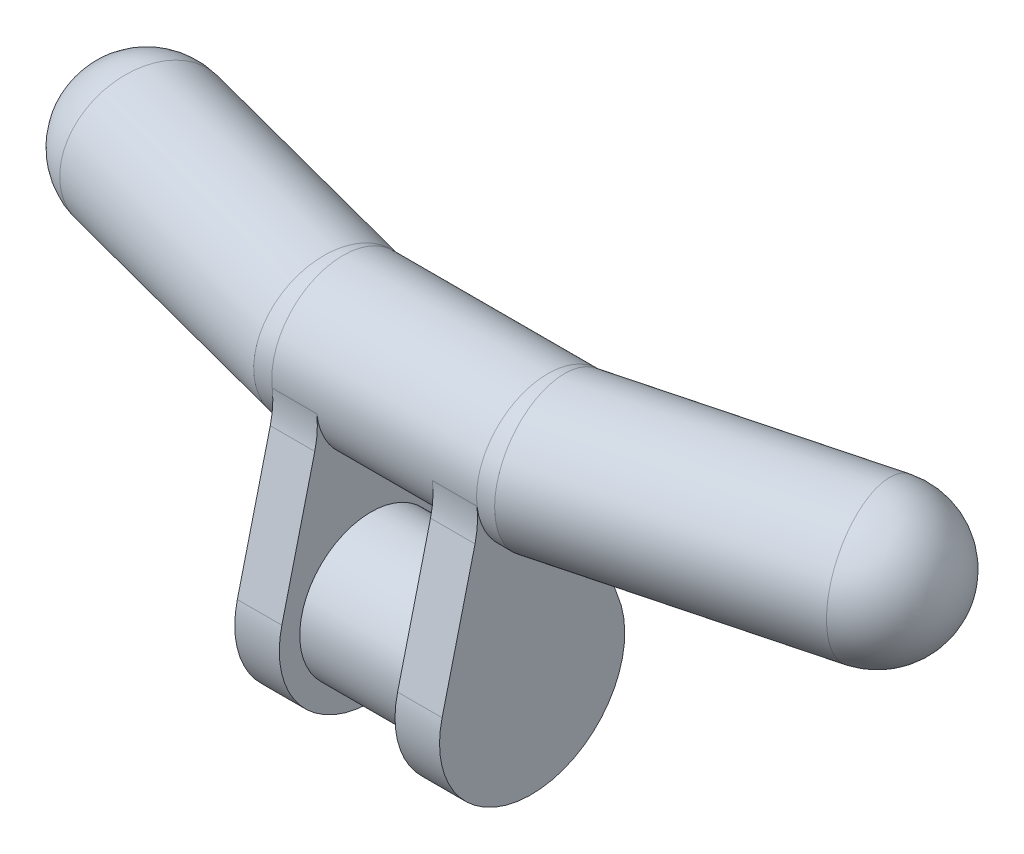
ISO-10303-21;
HEADER;
FILE_DESCRIPTION(('STEP AP214'),'2;1');
FILE_NAME('part.step','',(''),(''),'','','');
FILE_SCHEMA(('AUTOMOTIVE_DESIGN { 1 0 10303 214 1 1 1 1 }'));
ENDSEC;
DATA;
#1=APPLICATION_CONTEXT('core data for automotive mechanical design processes');
#2=APPLICATION_PROTOCOL_DEFINITION('international standard','automotive_design',2000,#1);
#3=PRODUCT_CONTEXT('',#1,'mechanical');
#4=PRODUCT('Part','Part','',(#3));
#5=PRODUCT_RELATED_PRODUCT_CATEGORY('part','',(#4));
#6=PRODUCT_DEFINITION_FORMATION('','',#4);
#7=PRODUCT_DEFINITION_CONTEXT('part definition',#1,'design');
#8=PRODUCT_DEFINITION('design','',#6,#7);
#9=PRODUCT_DEFINITION_SHAPE('','',#8);
#10=(LENGTH_UNIT() NAMED_UNIT(*) SI_UNIT(.MILLI.,.METRE.));
#11=(NAMED_UNIT(*) PLANE_ANGLE_UNIT() SI_UNIT($,.RADIAN.));
#12=(NAMED_UNIT(*) SI_UNIT($,.STERADIAN.) SOLID_ANGLE_UNIT());
#13=UNCERTAINTY_MEASURE_WITH_UNIT(LENGTH_MEASURE(1.E-05),#10,'distance_accuracy_value','');
#14=(GEOMETRIC_REPRESENTATION_CONTEXT(3) GLOBAL_UNCERTAINTY_ASSIGNED_CONTEXT((#13)) GLOBAL_UNIT_ASSIGNED_CONTEXT((#10,
#11,#12)) REPRESENTATION_CONTEXT('',''));
#15=CARTESIAN_POINT('',(0.,0.,0.));
#16=DIRECTION('',(0.,0.,1.));
#17=DIRECTION('',(1.,0.,0.));
#18=AXIS2_PLACEMENT_3D('',#15,#16,#17);
#19=CARTESIAN_POINT('',(-1.,4.30466864101486,-0.370929696670401));
#20=DIRECTION('',(1.,0.,0.));
#21=DIRECTION('',(0.,0.,-1.));
#22=AXIS2_PLACEMENT_3D('',#19,#20,#21);
#23=CYLINDRICAL_SURFACE('',#22,1.6);
#24=CARTESIAN_POINT('',(3.6,4.30466864101486,-0.370929696670401));
#25=DIRECTION('',(1.,0.,0.));
#26=DIRECTION('',(0.,0.,-1.));
#27=AXIS2_PLACEMENT_3D('',#24,#25,#26);
#28=CIRCLE('',#27,1.6);
#29=CARTESIAN_POINT('',(3.6,3.79624399129237,-1.88800068233803));
#30=VERTEX_POINT('',#29);
#31=CARTESIAN_POINT('',(3.6,3.91263772205239,-1.9221588088835));
#32=VERTEX_POINT('',#31);
#33=EDGE_CURVE('E186',#30,#32,#28,.T.);
#34=ORIENTED_EDGE('',*,*,#33,.F.);
#35=DIRECTION('',(1.,0.,0.));
#36=VECTOR('',#35,1.);
#37=CARTESIAN_POINT('',(-1.,3.79624399129237,-1.88800068233803));
#38=LINE('',#37,#36);
#39=CARTESIAN_POINT('',(2.6,3.79624399129237,-1.88800068233803));
#40=VERTEX_POINT('',#39);
#41=EDGE_CURVE('E294',#30,#40,#38,.F.);
#42=ORIENTED_EDGE('',*,*,#41,.T.);
#43=CARTESIAN_POINT('',(2.6,4.30466864101486,-0.370929696670401));
#44=DIRECTION('',(1.,0.,0.));
#45=DIRECTION('',(0.,0.,-1.));
#46=AXIS2_PLACEMENT_3D('',#43,#44,#45);
#47=CIRCLE('',#46,1.6);
#48=CARTESIAN_POINT('',(2.6,4.11878947478449,1.21823641659828));
#49=VERTEX_POINT('',#48);
#50=EDGE_CURVE('E239',#49,#40,#47,.T.);
#51=ORIENTED_EDGE('',*,*,#50,.F.);
#52=DIRECTION('',(1.,0.,0.));
#53=VECTOR('',#52,1.);
#54=CARTESIAN_POINT('',(-1.,4.11878947478449,1.21823641659828));
#55=LINE('',#54,#53);
#56=CARTESIAN_POINT('',(3.6,4.11878947478449,1.21823641659828));
#57=VERTEX_POINT('',#56);
#58=EDGE_CURVE('E289',#49,#57,#55,.T.);
#59=ORIENTED_EDGE('',*,*,#58,.T.);
#60=CARTESIAN_POINT('',(3.6,4.69669955997734,-1.9221588088835));
#61=VERTEX_POINT('',#60);
#62=EDGE_CURVE('E181',#61,#57,#28,.T.);
#63=ORIENTED_EDGE('',*,*,#62,.F.);
#64=CARTESIAN_POINT('',(3.8,4.30466864101486,-0.370929696670401));
#65=DIRECTION('',(0.991790731100458,0.,-0.127871598501075));
#66=DIRECTION('',(0.127871598501075,0.,0.991790731100458));
#67=AXIS2_PLACEMENT_3D('',#64,#65,#66);
#68=ELLIPSE('',#67,1.61324355010325,1.6);
#69=EDGE_CURVE('E190',#61,#32,#68,.F.);
#70=ORIENTED_EDGE('',*,*,#69,.T.);
#71=EDGE_LOOP('',(#34,#42,#51,#59,#63,#70));
#72=FACE_BOUND('',#71,.T.);
#73=CARTESIAN_POINT('',(0.,4.30466864101486,-0.370929696670401));
#74=DIRECTION('',(-1.,0.,0.));
#75=DIRECTION('',(0.,0.,1.));
#76=AXIS2_PLACEMENT_3D('',#73,#74,#75);
#77=CIRCLE('',#76,1.6);
#78=CARTESIAN_POINT('',(0.,3.79624399129237,-1.88800068233803));
#79=VERTEX_POINT('',#78);
#80=CARTESIAN_POINT('',(0.,4.11878947478449,1.21823641659828));
#81=VERTEX_POINT('',#80);
#82=EDGE_CURVE('E172',#79,#81,#77,.T.);
#83=ORIENTED_EDGE('',*,*,#82,.F.);
#84=DIRECTION('',(1.,0.,0.));
#85=VECTOR('',#84,1.);
#86=CARTESIAN_POINT('',(-1.,3.79624399129237,-1.88800068233803));
#87=LINE('',#86,#85);
#88=CARTESIAN_POINT('',(-1.,3.79624399129237,-1.88800068233803));
#89=VERTEX_POINT('',#88);
#90=EDGE_CURVE('E292',#79,#89,#87,.F.);
#91=ORIENTED_EDGE('',*,*,#90,.T.);
#92=CARTESIAN_POINT('',(-1.,4.30466864101486,-0.370929696670401));
#93=DIRECTION('',(1.,0.,0.));
#94=DIRECTION('',(0.,0.,-1.));
#95=AXIS2_PLACEMENT_3D('',#92,#93,#94);
#96=CIRCLE('',#95,1.6);
#97=CARTESIAN_POINT('',(-1.,3.91263772205226,-1.92215880888347));
#98=VERTEX_POINT('',#97);
#99=EDGE_CURVE('E180',#89,#98,#96,.T.);
#100=ORIENTED_EDGE('',*,*,#99,.T.);
#101=CARTESIAN_POINT('',(-1.2,4.30466864101486,-0.370929696670402));
#102=DIRECTION('',(0.991790731100457,0.,0.127871598501076));
#103=DIRECTION('',(-0.127871598501076,0.,0.991790731100457));
#104=AXIS2_PLACEMENT_3D('',#101,#102,#103);
#105=ELLIPSE('',#104,1.61324355010325,1.6);
#106=CARTESIAN_POINT('',(-1.,4.69669955997747,-1.92215880888347));
#107=VERTEX_POINT('',#106);
#108=EDGE_CURVE('E168',#107,#98,#105,.F.);
#109=ORIENTED_EDGE('',*,*,#108,.F.);
#110=CARTESIAN_POINT('',(-1.,4.11878947478449,1.21823641659828));
#111=VERTEX_POINT('',#110);
#112=EDGE_CURVE('E177',#107,#111,#96,.T.);
#113=ORIENTED_EDGE('',*,*,#112,.T.);
#114=DIRECTION('',(1.,0.,0.));
#115=VECTOR('',#114,1.);
#116=CARTESIAN_POINT('',(-1.,4.11878947478449,1.21823641659828));
#117=LINE('',#116,#115);
#118=EDGE_CURVE('E287',#111,#81,#117,.T.);
#119=ORIENTED_EDGE('',*,*,#118,.T.);
#120=EDGE_LOOP('',(#83,#91,#100,#109,#113,#119));
#121=FACE_BOUND('',#120,.T.);
#122=ADVANCED_FACE('F46',(#72,#121),#23,.T.);
#123=CARTESIAN_POINT('',(3.48377409491765,4.30466864101486,-0.288009290562191));
#124=DIRECTION('',(0.967297708593559,0.,-0.253643732328733));
#125=DIRECTION('',(-0.253643732328733,0.,-0.967297708593559));
#126=AXIS2_PLACEMENT_3D('',#123,#124,#125);
#127=CYLINDRICAL_SURFACE('',#126,1.6);
#128=CARTESIAN_POINT('',(9.507056480702,4.30466864101486,-1.86742771740993));
#129=DIRECTION('',(0.967297708593559,0.,-0.253643732328733));
#130=DIRECTION('',(-0.253643732328733,0.,-0.967297708593559));
#131=AXIS2_PLACEMENT_3D('',#128,#129,#130);
#132=CIRCLE('',#131,1.6);
#133=CARTESIAN_POINT('',(9.10122650897603,4.30466864101486,-3.41510405115962));
#134=VERTEX_POINT('',#133);
#135=EDGE_CURVE('E243',#134,#134,#132,.F.);
#136=ORIENTED_EDGE('',*,*,#135,.T.);
#137=EDGE_LOOP('',(#136));
#138=FACE_BOUND('',#137,.T.);
#139=CARTESIAN_POINT('',(3.8,4.30466864101486,-0.3709296966704));
#140=DIRECTION('',(0.991790731100458,0.,-0.127871598501075));
#141=DIRECTION('',(0.127871598501075,0.,0.991790731100458));
#142=AXIS2_PLACEMENT_3D('',#139,#140,#141);
#143=ELLIPSE('',#142,1.61324355010325,1.6);
#144=EDGE_CURVE('E192',#32,#61,#143,.F.);
#145=ORIENTED_EDGE('',*,*,#144,.F.);
#146=ORIENTED_EDGE('',*,*,#69,.F.);
#147=EDGE_LOOP('',(#145,#146));
#148=FACE_BOUND('',#147,.T.);
#149=ADVANCED_FACE('F366',(#138,#148),#127,.T.);
#150=CARTESIAN_POINT('',(-1.52691683467558,4.30466864101486,-0.370929696670401));
#151=DIRECTION('',(1.,0.,0.));
#152=DIRECTION('',(0.,0.,-1.));
#153=AXIS2_PLACEMENT_3D('',#150,#151,#152);
#154=CYLINDRICAL_SURFACE('',#153,1.6);
#155=EDGE_CURVE('E165',#98,#107,#105,.F.);
#156=ORIENTED_EDGE('',*,*,#155,.F.);
#157=ORIENTED_EDGE('',*,*,#99,.F.);
#158=EDGE_CURVE('E184',#111,#89,#96,.T.);
#159=ORIENTED_EDGE('',*,*,#158,.F.);
#160=ORIENTED_EDGE('',*,*,#112,.F.);
#161=EDGE_LOOP('',(#156,#157,#159,#160));
#162=FACE_BOUND('',#161,.T.);
#163=ADVANCED_FACE('F182',(#162),#154,.T.);
#164=CARTESIAN_POINT('',(3.6,4.30466864101486,-0.370929696670401));
#165=DIRECTION('',(1.,0.,0.));
#166=DIRECTION('',(0.,0.,-1.));
#167=AXIS2_PLACEMENT_3D('',#164,#165,#166);
#168=CYLINDRICAL_SURFACE('',#167,1.6);
#169=ORIENTED_EDGE('',*,*,#62,.T.);
#170=EDGE_CURVE('E62',#57,#30,#28,.T.);
#171=ORIENTED_EDGE('',*,*,#170,.T.);
#172=ORIENTED_EDGE('',*,*,#33,.T.);
#173=ORIENTED_EDGE('',*,*,#144,.T.);
#174=EDGE_LOOP('',(#169,#171,#172,#173));
#175=FACE_BOUND('',#174,.T.);
#176=ADVANCED_FACE('F377',(#175),#168,.T.);
#177=CARTESIAN_POINT('',(-8.4547328144517,4.30466864101486,-2.2732576891359));
#178=DIRECTION('',(0.967297708593559,0.,0.253643732328733));
#179=DIRECTION('',(0.253643732328733,0.,-0.967297708593559));
#180=AXIS2_PLACEMENT_3D('',#177,#178,#179);
#181=CYLINDRICAL_SURFACE('',#180,1.6);
#182=CARTESIAN_POINT('',(-6.907056480702,4.30466864101486,-1.86742771740993));
#183=DIRECTION('',(0.967297708593559,0.,0.253643732328733));
#184=DIRECTION('',(0.253643732328733,0.,-0.967297708593559));
#185=AXIS2_PLACEMENT_3D('',#182,#183,#184);
#186=CIRCLE('',#185,1.6);
#187=CARTESIAN_POINT('',(-6.50122650897603,4.30466864101486,-3.41510405115962));
#188=VERTEX_POINT('',#187);
#189=EDGE_CURVE('E246',#188,#188,#186,.T.);
#190=ORIENTED_EDGE('',*,*,#189,.T.);
#191=EDGE_LOOP('',(#190));
#192=FACE_BOUND('',#191,.T.);
#193=ORIENTED_EDGE('',*,*,#155,.T.);
#194=ORIENTED_EDGE('',*,*,#108,.T.);
#195=EDGE_LOOP('',(#193,#194));
#196=FACE_BOUND('',#195,.T.);
#197=ADVANCED_FACE('F167',(#192,#196),#181,.T.);
#198=CARTESIAN_POINT('',(2.6,0.,0.));
#199=DIRECTION('',(-1.,0.,0.));
#200=DIRECTION('',(0.,0.,1.));
#201=AXIS2_PLACEMENT_3D('',#198,#199,#200);
#202=CYLINDRICAL_SURFACE('',#201,1.6);
#203=CARTESIAN_POINT('',(2.6,0.,0.));
#204=DIRECTION('',(1.,0.,0.));
#205=DIRECTION('',(0.,0.,-1.));
#206=AXIS2_PLACEMENT_3D('',#203,#204,#205);
#207=CIRCLE('',#206,1.6);
#208=CARTESIAN_POINT('',(2.6,0.,-1.6));
#209=VERTEX_POINT('',#208);
#210=EDGE_CURVE('E236',#209,#209,#207,.T.);
#211=ORIENTED_EDGE('',*,*,#210,.F.);
#212=EDGE_LOOP('',(#211));
#213=FACE_BOUND('',#212,.T.);
#214=CARTESIAN_POINT('',(0.,0.,0.));
#215=DIRECTION('',(1.,0.,0.));
#216=DIRECTION('',(0.,0.,-1.));
#217=AXIS2_PLACEMENT_3D('',#214,#215,#216);
#218=CIRCLE('',#217,1.6);
#219=CARTESIAN_POINT('',(0.,0.,-1.6));
#220=VERTEX_POINT('',#219);
#221=EDGE_CURVE('E228',#220,#220,#218,.T.);
#222=ORIENTED_EDGE('',*,*,#221,.T.);
#223=EDGE_LOOP('',(#222));
#224=FACE_BOUND('',#223,.T.);
#225=ADVANCED_FACE('F373',(#213,#224),#202,.T.);
#226=CARTESIAN_POINT('',(-1.,0.,0.));
#227=DIRECTION('',(1.,0.,0.));
#228=DIRECTION('',(0.,0.,-1.));
#229=AXIS2_PLACEMENT_3D('',#226,#227,#228);
#230=CYLINDRICAL_SURFACE('',#229,2.1);
#231=CARTESIAN_POINT('',(0.,0.,0.));
#232=DIRECTION('',(-1.,0.,0.));
#233=DIRECTION('',(0.,0.,1.));
#234=AXIS2_PLACEMENT_3D('',#231,#232,#233);
#235=CIRCLE('',#234,2.1);
#236=CARTESIAN_POINT('',(0.,0.808031465523659,-1.93832018787498));
#237=VERTEX_POINT('',#236);
#238=CARTESIAN_POINT('',(0.,-1.67753876962392,1.26327498052034));
#239=VERTEX_POINT('',#238);
#240=EDGE_CURVE('E210',#237,#239,#235,.T.);
#241=ORIENTED_EDGE('',*,*,#240,.T.);
#242=DIRECTION('',(1.,0.,0.));
#243=VECTOR('',#242,1.);
#244=CARTESIAN_POINT('',(-1.,-1.67753876962392,1.26327498052034));
#245=LINE('',#244,#243);
#246=CARTESIAN_POINT('',(-1.,-1.67753876962392,1.26327498052034));
#247=VERTEX_POINT('',#246);
#248=EDGE_CURVE('E273',#239,#247,#245,.F.);
#249=ORIENTED_EDGE('',*,*,#248,.T.);
#250=CARTESIAN_POINT('',(-1.,0.,0.));
#251=DIRECTION('',(-1.,0.,0.));
#252=DIRECTION('',(0.,0.,1.));
#253=AXIS2_PLACEMENT_3D('',#250,#251,#252);
#254=CIRCLE('',#253,2.1);
#255=CARTESIAN_POINT('',(-1.,0.808031465523659,-1.93832018787498));
#256=VERTEX_POINT('',#255);
#257=EDGE_CURVE('E218',#256,#247,#254,.T.);
#258=ORIENTED_EDGE('',*,*,#257,.F.);
#259=DIRECTION('',(1.,0.,0.));
#260=VECTOR('',#259,1.);
#261=CARTESIAN_POINT('',(-1.,0.808031465523659,-1.93832018787498));
#262=LINE('',#261,#260);
#263=EDGE_CURVE('E270',#256,#237,#262,.T.);
#264=ORIENTED_EDGE('',*,*,#263,.T.);
#265=EDGE_LOOP('',(#241,#249,#258,#264));
#266=FACE_BOUND('',#265,.T.);
#267=ADVANCED_FACE('F349',(#266),#230,.T.);
#268=CARTESIAN_POINT('',(-1.,0.,2.1));
#269=DIRECTION('',(0.,-0.23857429684484,-0.971124247913206));
#270=DIRECTION('',(0.,0.971124247913206,-0.23857429684484));
#271=AXIS2_PLACEMENT_3D('',#268,#269,#270);
#272=PLANE('',#271);
#273=DIRECTION('',(0.,0.971124247913206,-0.23857429684484));
#274=VECTOR('',#273,1.);
#275=CARTESIAN_POINT('',(-1.,0.,2.1));
#276=LINE('',#275,#274);
#277=CARTESIAN_POINT('',(-1.,0.397265795136159,2.00240444727976));
#278=VERTEX_POINT('',#277);
#279=CARTESIAN_POINT('',(-1.,3.40929192330684,1.26244556235773));
#280=VERTEX_POINT('',#279);
#281=EDGE_CURVE('E221',#278,#280,#276,.T.);
#282=ORIENTED_EDGE('',*,*,#281,.F.);
#283=DIRECTION('',(1.,0.,0.));
#284=VECTOR('',#283,1.);
#285=CARTESIAN_POINT('',(-1.,0.397265795136159,2.00240444727976));
#286=LINE('',#285,#284);
#287=CARTESIAN_POINT('',(0.,0.397265795136159,2.00240444727976));
#288=VERTEX_POINT('',#287);
#289=EDGE_CURVE('E265',#278,#288,#286,.T.);
#290=ORIENTED_EDGE('',*,*,#289,.T.);
#291=DIRECTION('',(0.,0.971124247913206,-0.23857429684484));
#292=VECTOR('',#291,1.);
#293=CARTESIAN_POINT('',(0.,0.,2.1));
#294=LINE('',#293,#292);
#295=CARTESIAN_POINT('',(0.,3.40929192330684,1.26244556235773));
#296=VERTEX_POINT('',#295);
#297=EDGE_CURVE('E231',#288,#296,#294,.T.);
#298=ORIENTED_EDGE('',*,*,#297,.T.);
#299=DIRECTION('',(1.,0.,0.));
#300=VECTOR('',#299,1.);
#301=CARTESIAN_POINT('',(-1.,3.40929192330684,1.26244556235773));
#302=LINE('',#301,#300);
#303=EDGE_CURVE('E262',#296,#280,#302,.F.);
#304=ORIENTED_EDGE('',*,*,#303,.T.);
#305=EDGE_LOOP('',(#282,#290,#298,#304));
#306=FACE_BOUND('',#305,.T.);
#307=ADVANCED_FACE('F326',(#306),#272,.F.);
#308=CARTESIAN_POINT('',(-1.,1.10730883412809,-1.78433941442258));
#309=DIRECTION('',(0.,0.,1.));
#310=DIRECTION('',(1.,0.,0.));
#311=AXIS2_PLACEMENT_3D('',#308,#309,#310);
#312=PLANE('',#311);
#313=DIRECTION('',(0.,-1.,0.));
#314=VECTOR('',#313,1.);
#315=CARTESIAN_POINT('',(0.,1.10730883412809,-1.78433941442258));
#316=LINE('',#315,#314);
#317=CARTESIAN_POINT('',(0.,3.16071317913926,-1.78433941442258));
#318=VERTEX_POINT('',#317);
#319=CARTESIAN_POINT('',(0.,1.57758524221286,-1.78433941442258));
#320=VERTEX_POINT('',#319);
#321=EDGE_CURVE('E222',#318,#320,#316,.T.);
#322=ORIENTED_EDGE('',*,*,#321,.T.);
#323=DIRECTION('',(-1.,0.,0.));
#324=VECTOR('',#323,1.);
#325=CARTESIAN_POINT('',(-1.,1.57758524221286,-1.78433941442258));
#326=LINE('',#325,#324);
#327=CARTESIAN_POINT('',(-1.,1.57758524221286,-1.78433941442258));
#328=VERTEX_POINT('',#327);
#329=EDGE_CURVE('E280',#320,#328,#326,.T.);
#330=ORIENTED_EDGE('',*,*,#329,.T.);
#331=DIRECTION('',(0.,-1.,0.));
#332=VECTOR('',#331,1.);
#333=CARTESIAN_POINT('',(-1.,1.10730883412809,-1.78433941442258));
#334=LINE('',#333,#332);
#335=CARTESIAN_POINT('',(-1.,3.16071317913926,-1.78433941442258));
#336=VERTEX_POINT('',#335);
#337=EDGE_CURVE('E225',#336,#328,#334,.T.);
#338=ORIENTED_EDGE('',*,*,#337,.F.);
#339=DIRECTION('',(1.,0.,0.));
#340=VECTOR('',#339,1.);
#341=CARTESIAN_POINT('',(-1.,3.16071317913926,-1.78433941442258));
#342=LINE('',#341,#340);
#343=EDGE_CURVE('E277',#336,#318,#342,.T.);
#344=ORIENTED_EDGE('',*,*,#343,.T.);
#345=EDGE_LOOP('',(#322,#330,#338,#344));
#346=FACE_BOUND('',#345,.T.);
#347=ADVANCED_FACE('F341',(#346),#312,.F.);
#348=CARTESIAN_POINT('',(-1.,0.,0.));
#349=DIRECTION('',(-1.,0.,0.));
#350=DIRECTION('',(0.,0.,1.));
#351=AXIS2_PLACEMENT_3D('',#348,#349,#350);
#352=PLANE('',#351);
#353=ORIENTED_EDGE('',*,*,#257,.T.);
#354=CARTESIAN_POINT('',(-1.,-0.0798827985535204,0.0601559514533494));
#355=DIRECTION('',(-1.,0.,0.));
#356=DIRECTION('',(0.,0.,1.));
#357=AXIS2_PLACEMENT_3D('',#354,#355,#356);
#358=CIRCLE('',#357,2.);
#359=EDGE_CURVE('E275',#247,#278,#358,.T.);
#360=ORIENTED_EDGE('',*,*,#359,.T.);
#361=ORIENTED_EDGE('',*,*,#281,.T.);
#362=CARTESIAN_POINT('',(-1.,3.88644051699652,3.20469405818414));
#363=DIRECTION('',(-1.,0.,0.));
#364=DIRECTION('',(0.,0.,1.));
#365=AXIS2_PLACEMENT_3D('',#362,#363,#364);
#366=CIRCLE('',#365,2.);
#367=EDGE_CURVE('E55',#280,#111,#366,.F.);
#368=ORIENTED_EDGE('',*,*,#367,.T.);
#369=ORIENTED_EDGE('',*,*,#158,.T.);
#370=CARTESIAN_POINT('',(-1.,3.16071317913926,-3.78433941442258));
#371=DIRECTION('',(-1.,0.,0.));
#372=DIRECTION('',(0.,0.,1.));
#373=AXIS2_PLACEMENT_3D('',#370,#371,#372);
#374=CIRCLE('',#373,2.);
#375=EDGE_CURVE('E313',#89,#336,#374,.F.);
#376=ORIENTED_EDGE('',*,*,#375,.T.);
#377=ORIENTED_EDGE('',*,*,#337,.T.);
#378=CARTESIAN_POINT('',(-1.,1.57758524221286,-3.78433941442258));
#379=DIRECTION('',(-1.,0.,0.));
#380=DIRECTION('',(0.,0.,1.));
#381=AXIS2_PLACEMENT_3D('',#378,#379,#380);
#382=CIRCLE('',#381,2.);
#383=EDGE_CURVE('E299',#328,#256,#382,.F.);
#384=ORIENTED_EDGE('',*,*,#383,.T.);
#385=EDGE_LOOP('',(#353,#360,#361,#368,#369,#376,#377,#384));
#386=FACE_BOUND('',#385,.T.);
#387=ADVANCED_FACE('F320',(#386),#352,.T.);
#388=CARTESIAN_POINT('',(0.,0.,0.));
#389=DIRECTION('',(-1.,0.,0.));
#390=DIRECTION('',(0.,0.,1.));
#391=AXIS2_PLACEMENT_3D('',#388,#389,#390);
#392=PLANE('',#391);
#393=ORIENTED_EDGE('',*,*,#221,.F.);
#394=EDGE_LOOP('',(#393));
#395=FACE_BOUND('',#394,.T.);
#396=ORIENTED_EDGE('',*,*,#297,.F.);
#397=CARTESIAN_POINT('',(0.,-0.0798827985535204,0.0601559514533494));
#398=DIRECTION('',(-1.,0.,0.));
#399=DIRECTION('',(0.,0.,1.));
#400=AXIS2_PLACEMENT_3D('',#397,#398,#399);
#401=CIRCLE('',#400,2.);
#402=EDGE_CURVE('E268',#288,#239,#401,.F.);
#403=ORIENTED_EDGE('',*,*,#402,.T.);
#404=ORIENTED_EDGE('',*,*,#240,.F.);
#405=CARTESIAN_POINT('',(0.,1.57758524221286,-3.78433941442258));
#406=DIRECTION('',(-1.,0.,0.));
#407=DIRECTION('',(0.,0.,1.));
#408=AXIS2_PLACEMENT_3D('',#405,#406,#407);
#409=CIRCLE('',#408,2.);
#410=EDGE_CURVE('E297',#237,#320,#409,.T.);
#411=ORIENTED_EDGE('',*,*,#410,.T.);
#412=ORIENTED_EDGE('',*,*,#321,.F.);
#413=CARTESIAN_POINT('',(0.,3.16071317913926,-3.78433941442258));
#414=DIRECTION('',(-1.,0.,0.));
#415=DIRECTION('',(0.,0.,1.));
#416=AXIS2_PLACEMENT_3D('',#413,#414,#415);
#417=CIRCLE('',#416,2.);
#418=EDGE_CURVE('E310',#318,#79,#417,.T.);
#419=ORIENTED_EDGE('',*,*,#418,.T.);
#420=ORIENTED_EDGE('',*,*,#82,.T.);
#421=CARTESIAN_POINT('',(0.,3.88644051699652,3.20469405818414));
#422=DIRECTION('',(-1.,0.,0.));
#423=DIRECTION('',(0.,0.,1.));
#424=AXIS2_PLACEMENT_3D('',#421,#422,#423);
#425=CIRCLE('',#424,2.);
#426=EDGE_CURVE('E12',#81,#296,#425,.T.);
#427=ORIENTED_EDGE('',*,*,#426,.T.);
#428=EDGE_LOOP('',(#396,#403,#404,#411,#412,#419,#420,#427));
#429=FACE_BOUND('',#428,.T.);
#430=ADVANCED_FACE('F330',(#395,#429),#392,.F.);
#431=CARTESIAN_POINT('',(3.6,0.,0.));
#432=DIRECTION('',(-1.,0.,0.));
#433=DIRECTION('',(0.,0.,1.));
#434=AXIS2_PLACEMENT_3D('',#431,#432,#433);
#435=CYLINDRICAL_SURFACE('',#434,2.1);
#436=CARTESIAN_POINT('',(3.6,0.,0.));
#437=DIRECTION('',(-1.,0.,0.));
#438=DIRECTION('',(0.,0.,1.));
#439=AXIS2_PLACEMENT_3D('',#436,#437,#438);
#440=CIRCLE('',#439,2.1);
#441=CARTESIAN_POINT('',(3.6,0.808031465523659,-1.93832018787498));
#442=VERTEX_POINT('',#441);
#443=CARTESIAN_POINT('',(3.6,-1.67753876962392,1.26327498052034));
#444=VERTEX_POINT('',#443);
#445=EDGE_CURVE('E200',#442,#444,#440,.T.);
#446=ORIENTED_EDGE('',*,*,#445,.T.);
#447=DIRECTION('',(-1.,0.,0.));
#448=VECTOR('',#447,1.);
#449=CARTESIAN_POINT('',(3.6,-1.67753876962392,1.26327498052034));
#450=LINE('',#449,#448);
#451=CARTESIAN_POINT('',(2.6,-1.67753876962392,1.26327498052034));
#452=VERTEX_POINT('',#451);
#453=EDGE_CURVE('E251',#444,#452,#450,.T.);
#454=ORIENTED_EDGE('',*,*,#453,.T.);
#455=CARTESIAN_POINT('',(2.6,0.,0.));
#456=DIRECTION('',(-1.,0.,0.));
#457=DIRECTION('',(0.,0.,1.));
#458=AXIS2_PLACEMENT_3D('',#455,#456,#457);
#459=CIRCLE('',#458,2.1);
#460=CARTESIAN_POINT('',(2.6,0.808031465523659,-1.93832018787498));
#461=VERTEX_POINT('',#460);
#462=EDGE_CURVE('E199',#461,#452,#459,.T.);
#463=ORIENTED_EDGE('',*,*,#462,.F.);
#464=DIRECTION('',(-1.,0.,0.));
#465=VECTOR('',#464,1.);
#466=CARTESIAN_POINT('',(3.6,0.808031465523659,-1.93832018787498));
#467=LINE('',#466,#465);
#468=EDGE_CURVE('E249',#461,#442,#467,.F.);
#469=ORIENTED_EDGE('',*,*,#468,.T.);
#470=EDGE_LOOP('',(#446,#454,#463,#469));
#471=FACE_BOUND('',#470,.T.);
#472=ADVANCED_FACE('F438',(#471),#435,.T.);
#473=CARTESIAN_POINT('',(3.6,1.10730883412809,-1.78433941442258));
#474=DIRECTION('',(0.,0.,-1.));
#475=DIRECTION('',(-1.,0.,0.));
#476=AXIS2_PLACEMENT_3D('',#473,#474,#475);
#477=PLANE('',#476);
#478=DIRECTION('',(0.,-1.,0.));
#479=VECTOR('',#478,1.);
#480=CARTESIAN_POINT('',(3.6,1.10730883412809,-1.78433941442258));
#481=LINE('',#480,#479);
#482=CARTESIAN_POINT('',(3.6,3.16071317913926,-1.78433941442258));
#483=VERTEX_POINT('',#482);
#484=CARTESIAN_POINT('',(3.6,1.57758524221286,-1.78433941442258));
#485=VERTEX_POINT('',#484);
#486=EDGE_CURVE('E203',#483,#485,#481,.T.);
#487=ORIENTED_EDGE('',*,*,#486,.T.);
#488=DIRECTION('',(1.,0.,0.));
#489=VECTOR('',#488,1.);
#490=CARTESIAN_POINT('',(2.6,1.57758524221286,-1.78433941442258));
#491=LINE('',#490,#489);
#492=CARTESIAN_POINT('',(2.6,1.57758524221286,-1.78433941442258));
#493=VERTEX_POINT('',#492);
#494=EDGE_CURVE('E284',#485,#493,#491,.F.);
#495=ORIENTED_EDGE('',*,*,#494,.T.);
#496=DIRECTION('',(0.,-1.,0.));
#497=VECTOR('',#496,1.);
#498=CARTESIAN_POINT('',(2.6,1.10730883412809,-1.78433941442258));
#499=LINE('',#498,#497);
#500=CARTESIAN_POINT('',(2.6,3.16071317913926,-1.78433941442258));
#501=VERTEX_POINT('',#500);
#502=EDGE_CURVE('E213',#501,#493,#499,.T.);
#503=ORIENTED_EDGE('',*,*,#502,.F.);
#504=DIRECTION('',(-1.,0.,0.));
#505=VECTOR('',#504,1.);
#506=CARTESIAN_POINT('',(3.6,3.16071317913926,-1.78433941442258));
#507=LINE('',#506,#505);
#508=EDGE_CURVE('E282',#501,#483,#507,.F.);
#509=ORIENTED_EDGE('',*,*,#508,.T.);
#510=EDGE_LOOP('',(#487,#495,#503,#509));
#511=FACE_BOUND('',#510,.T.);
#512=ADVANCED_FACE('F448',(#511),#477,.T.);
#513=CARTESIAN_POINT('',(3.6,0.,2.1));
#514=DIRECTION('',(0.,0.23857429684484,0.971124247913206));
#515=DIRECTION('',(0.,-0.971124247913206,0.23857429684484));
#516=AXIS2_PLACEMENT_3D('',#513,#514,#515);
#517=PLANE('',#516);
#518=DIRECTION('',(0.,0.971124247913206,-0.23857429684484));
#519=VECTOR('',#518,1.);
#520=CARTESIAN_POINT('',(2.6,0.,2.1));
#521=LINE('',#520,#519);
#522=CARTESIAN_POINT('',(2.6,0.397265795136159,2.00240444727976));
#523=VERTEX_POINT('',#522);
#524=CARTESIAN_POINT('',(2.6,3.40929192330684,1.26244556235773));
#525=VERTEX_POINT('',#524);
#526=EDGE_CURVE('E204',#523,#525,#521,.T.);
#527=ORIENTED_EDGE('',*,*,#526,.F.);
#528=DIRECTION('',(-1.,0.,0.));
#529=VECTOR('',#528,1.);
#530=CARTESIAN_POINT('',(3.6,0.397265795136159,2.00240444727976));
#531=LINE('',#530,#529);
#532=CARTESIAN_POINT('',(3.6,0.397265795136159,2.00240444727976));
#533=VERTEX_POINT('',#532);
#534=EDGE_CURVE('E258',#523,#533,#531,.F.);
#535=ORIENTED_EDGE('',*,*,#534,.T.);
#536=DIRECTION('',(0.,0.971124247913206,-0.23857429684484));
#537=VECTOR('',#536,1.);
#538=CARTESIAN_POINT('',(3.6,0.,2.1));
#539=LINE('',#538,#537);
#540=CARTESIAN_POINT('',(3.6,3.40929192330684,1.26244556235773));
#541=VERTEX_POINT('',#540);
#542=EDGE_CURVE('E207',#533,#541,#539,.T.);
#543=ORIENTED_EDGE('',*,*,#542,.T.);
#544=DIRECTION('',(-1.,0.,0.));
#545=VECTOR('',#544,1.);
#546=CARTESIAN_POINT('',(2.6,3.40929192330684,1.26244556235773));
#547=LINE('',#546,#545);
#548=EDGE_CURVE('E256',#541,#525,#547,.T.);
#549=ORIENTED_EDGE('',*,*,#548,.T.);
#550=EDGE_LOOP('',(#527,#535,#543,#549));
#551=FACE_BOUND('',#550,.T.);
#552=ADVANCED_FACE('F458',(#551),#517,.T.);
#553=CARTESIAN_POINT('',(3.6,0.,0.));
#554=DIRECTION('',(1.,0.,0.));
#555=DIRECTION('',(0.,0.,1.));
#556=AXIS2_PLACEMENT_3D('',#553,#554,#555);
#557=PLANE('',#556);
#558=ORIENTED_EDGE('',*,*,#542,.F.);
#559=CARTESIAN_POINT('',(3.6,-0.0798827985535204,0.0601559514533494));
#560=DIRECTION('',(1.,0.,0.));
#561=DIRECTION('',(0.,0.,-1.));
#562=AXIS2_PLACEMENT_3D('',#559,#560,#561);
#563=CIRCLE('',#562,2.);
#564=EDGE_CURVE('E260',#533,#444,#563,.T.);
#565=ORIENTED_EDGE('',*,*,#564,.T.);
#566=ORIENTED_EDGE('',*,*,#445,.F.);
#567=CARTESIAN_POINT('',(3.6,1.57758524221286,-3.78433941442258));
#568=DIRECTION('',(1.,0.,0.));
#569=DIRECTION('',(0.,0.,-1.));
#570=AXIS2_PLACEMENT_3D('',#567,#568,#569);
#571=CIRCLE('',#570,2.);
#572=EDGE_CURVE('E303',#442,#485,#571,.F.);
#573=ORIENTED_EDGE('',*,*,#572,.T.);
#574=ORIENTED_EDGE('',*,*,#486,.F.);
#575=CARTESIAN_POINT('',(3.6,3.16071317913926,-3.78433941442258));
#576=DIRECTION('',(1.,0.,0.));
#577=DIRECTION('',(0.,0.,-1.));
#578=AXIS2_PLACEMENT_3D('',#575,#576,#577);
#579=CIRCLE('',#578,2.);
#580=EDGE_CURVE('E307',#483,#30,#579,.F.);
#581=ORIENTED_EDGE('',*,*,#580,.T.);
#582=ORIENTED_EDGE('',*,*,#170,.F.);
#583=CARTESIAN_POINT('',(3.6,3.88644051699652,3.20469405818414));
#584=DIRECTION('',(1.,0.,0.));
#585=DIRECTION('',(0.,0.,-1.));
#586=AXIS2_PLACEMENT_3D('',#583,#584,#585);
#587=CIRCLE('',#586,2.);
#588=EDGE_CURVE('E315',#57,#541,#587,.F.);
#589=ORIENTED_EDGE('',*,*,#588,.T.);
#590=EDGE_LOOP('',(#558,#565,#566,#573,#574,#581,#582,#589));
#591=FACE_BOUND('',#590,.T.);
#592=ADVANCED_FACE('F468',(#591),#557,.T.);
#593=CARTESIAN_POINT('',(2.6,0.,0.));
#594=DIRECTION('',(1.,0.,0.));
#595=DIRECTION('',(0.,0.,1.));
#596=AXIS2_PLACEMENT_3D('',#593,#594,#595);
#597=PLANE('',#596);
#598=ORIENTED_EDGE('',*,*,#210,.T.);
#599=EDGE_LOOP('',(#598));
#600=FACE_BOUND('',#599,.T.);
#601=ORIENTED_EDGE('',*,*,#462,.T.);
#602=CARTESIAN_POINT('',(2.6,-0.0798827985535204,0.0601559514533494));
#603=DIRECTION('',(1.,0.,0.));
#604=DIRECTION('',(0.,0.,-1.));
#605=AXIS2_PLACEMENT_3D('',#602,#603,#604);
#606=CIRCLE('',#605,2.);
#607=EDGE_CURVE('E254',#452,#523,#606,.F.);
#608=ORIENTED_EDGE('',*,*,#607,.T.);
#609=ORIENTED_EDGE('',*,*,#526,.T.);
#610=CARTESIAN_POINT('',(2.6,3.88644051699652,3.20469405818414));
#611=DIRECTION('',(1.,0.,0.));
#612=DIRECTION('',(0.,0.,-1.));
#613=AXIS2_PLACEMENT_3D('',#610,#611,#612);
#614=CIRCLE('',#613,2.);
#615=EDGE_CURVE('E317',#525,#49,#614,.T.);
#616=ORIENTED_EDGE('',*,*,#615,.T.);
#617=ORIENTED_EDGE('',*,*,#50,.T.);
#618=CARTESIAN_POINT('',(2.6,3.16071317913926,-3.78433941442258));
#619=DIRECTION('',(1.,0.,0.));
#620=DIRECTION('',(0.,0.,-1.));
#621=AXIS2_PLACEMENT_3D('',#618,#619,#620);
#622=CIRCLE('',#621,2.);
#623=EDGE_CURVE('E305',#40,#501,#622,.T.);
#624=ORIENTED_EDGE('',*,*,#623,.T.);
#625=ORIENTED_EDGE('',*,*,#502,.T.);
#626=CARTESIAN_POINT('',(2.6,1.57758524221286,-3.78433941442258));
#627=DIRECTION('',(1.,0.,0.));
#628=DIRECTION('',(0.,0.,-1.));
#629=AXIS2_PLACEMENT_3D('',#626,#627,#628);
#630=CIRCLE('',#629,2.);
#631=EDGE_CURVE('E301',#493,#461,#630,.T.);
#632=ORIENTED_EDGE('',*,*,#631,.T.);
#633=EDGE_LOOP('',(#601,#608,#609,#616,#617,#624,#625,#632));
#634=FACE_BOUND('',#633,.T.);
#635=ADVANCED_FACE('F478',(#600,#634),#597,.F.);
#636=CARTESIAN_POINT('',(9.507056480702,4.30466864101486,-1.86742771740993));
#637=DIRECTION('',(0.967297708593559,0.,-0.253643732328733));
#638=DIRECTION('',(-0.253643732328733,0.,-0.967297708593559));
#639=AXIS2_PLACEMENT_3D('',#636,#637,#638);
#640=SPHERICAL_SURFACE('',#639,1.6);
#641=ORIENTED_EDGE('',*,*,#135,.F.);
#642=EDGE_LOOP('',(#641));
#643=FACE_BOUND('',#642,.T.);
#644=ADVANCED_FACE('F488',(#643),#640,.T.);
#645=CARTESIAN_POINT('',(-6.907056480702,4.30466864101486,-1.86742771740993));
#646=DIRECTION('',(0.967297708593559,0.,0.253643732328733));
#647=DIRECTION('',(0.253643732328733,0.,-0.967297708593559));
#648=AXIS2_PLACEMENT_3D('',#645,#646,#647);
#649=SPHERICAL_SURFACE('',#648,1.6);
#650=ORIENTED_EDGE('',*,*,#189,.F.);
#651=EDGE_LOOP('',(#650));
#652=FACE_BOUND('',#651,.T.);
#653=ADVANCED_FACE('F362',(#652),#649,.T.);
#654=CARTESIAN_POINT('',(3.6,-0.0798827985535204,0.0601559514533494));
#655=DIRECTION('',(-1.,0.,0.));
#656=DIRECTION('',(0.,0.,1.));
#657=AXIS2_PLACEMENT_3D('',#654,#655,#656);
#658=CYLINDRICAL_SURFACE('',#657,2.);
#659=ORIENTED_EDGE('',*,*,#564,.F.);
#660=ORIENTED_EDGE('',*,*,#534,.F.);
#661=ORIENTED_EDGE('',*,*,#607,.F.);
#662=ORIENTED_EDGE('',*,*,#453,.F.);
#663=EDGE_LOOP('',(#659,#660,#661,#662));
#664=FACE_BOUND('',#663,.T.);
#665=ADVANCED_FACE('F354',(#664),#658,.T.);
#666=CARTESIAN_POINT('',(-1.,-0.0798827985535204,0.0601559514533494));
#667=DIRECTION('',(1.,0.,0.));
#668=DIRECTION('',(0.,0.,-1.));
#669=AXIS2_PLACEMENT_3D('',#666,#667,#668);
#670=CYLINDRICAL_SURFACE('',#669,2.);
#671=ORIENTED_EDGE('',*,*,#359,.F.);
#672=ORIENTED_EDGE('',*,*,#248,.F.);
#673=ORIENTED_EDGE('',*,*,#402,.F.);
#674=ORIENTED_EDGE('',*,*,#289,.F.);
#675=EDGE_LOOP('',(#671,#672,#673,#674));
#676=FACE_BOUND('',#675,.T.);
#677=ADVANCED_FACE('F352',(#676),#670,.T.);
#678=CARTESIAN_POINT('',(-1.,1.57758524221286,-3.78433941442258));
#679=DIRECTION('',(1.,0.,0.));
#680=DIRECTION('',(0.,0.,-1.));
#681=AXIS2_PLACEMENT_3D('',#678,#679,#680);
#682=CYLINDRICAL_SURFACE('',#681,2.);
#683=ORIENTED_EDGE('',*,*,#383,.F.);
#684=ORIENTED_EDGE('',*,*,#329,.F.);
#685=ORIENTED_EDGE('',*,*,#410,.F.);
#686=ORIENTED_EDGE('',*,*,#263,.F.);
#687=EDGE_LOOP('',(#683,#684,#685,#686));
#688=FACE_BOUND('',#687,.T.);
#689=ADVANCED_FACE('F344',(#688),#682,.F.);
#690=CARTESIAN_POINT('',(3.6,1.57758524221286,-3.78433941442258));
#691=DIRECTION('',(-1.,0.,0.));
#692=DIRECTION('',(0.,0.,1.));
#693=AXIS2_PLACEMENT_3D('',#690,#691,#692);
#694=CYLINDRICAL_SURFACE('',#693,2.);
#695=ORIENTED_EDGE('',*,*,#572,.F.);
#696=ORIENTED_EDGE('',*,*,#468,.F.);
#697=ORIENTED_EDGE('',*,*,#631,.F.);
#698=ORIENTED_EDGE('',*,*,#494,.F.);
#699=EDGE_LOOP('',(#695,#696,#697,#698));
#700=FACE_BOUND('',#699,.T.);
#701=ADVANCED_FACE('F360',(#700),#694,.F.);
#702=CARTESIAN_POINT('',(-1.,3.16071317913926,-3.78433941442258));
#703=DIRECTION('',(1.,0.,0.));
#704=DIRECTION('',(0.,0.,-1.));
#705=AXIS2_PLACEMENT_3D('',#702,#703,#704);
#706=CYLINDRICAL_SURFACE('',#705,2.);
#707=ORIENTED_EDGE('',*,*,#580,.F.);
#708=ORIENTED_EDGE('',*,*,#508,.F.);
#709=ORIENTED_EDGE('',*,*,#623,.F.);
#710=ORIENTED_EDGE('',*,*,#41,.F.);
#711=EDGE_LOOP('',(#707,#708,#709,#710));
#712=FACE_BOUND('',#711,.T.);
#713=ADVANCED_FACE('F518',(#712),#706,.F.);
#714=CARTESIAN_POINT('',(-1.,3.16071317913926,-3.78433941442258));
#715=DIRECTION('',(1.,0.,0.));
#716=DIRECTION('',(0.,0.,-1.));
#717=AXIS2_PLACEMENT_3D('',#714,#715,#716);
#718=CYLINDRICAL_SURFACE('',#717,2.);
#719=ORIENTED_EDGE('',*,*,#375,.F.);
#720=ORIENTED_EDGE('',*,*,#90,.F.);
#721=ORIENTED_EDGE('',*,*,#418,.F.);
#722=ORIENTED_EDGE('',*,*,#343,.F.);
#723=EDGE_LOOP('',(#719,#720,#721,#722));
#724=FACE_BOUND('',#723,.T.);
#725=ADVANCED_FACE('F337',(#724),#718,.F.);
#726=CARTESIAN_POINT('',(-1.,3.88644051699652,3.20469405818414));
#727=DIRECTION('',(1.,0.,0.));
#728=DIRECTION('',(0.,0.,-1.));
#729=AXIS2_PLACEMENT_3D('',#726,#727,#728);
#730=CYLINDRICAL_SURFACE('',#729,2.);
#731=ORIENTED_EDGE('',*,*,#615,.F.);
#732=ORIENTED_EDGE('',*,*,#548,.F.);
#733=ORIENTED_EDGE('',*,*,#588,.F.);
#734=ORIENTED_EDGE('',*,*,#58,.F.);
#735=EDGE_LOOP('',(#731,#732,#733,#734));
#736=FACE_BOUND('',#735,.T.);
#737=ADVANCED_FACE('F537',(#736),#730,.F.);
#738=CARTESIAN_POINT('',(-1.,3.88644051699652,3.20469405818414));
#739=DIRECTION('',(1.,0.,0.));
#740=DIRECTION('',(0.,0.,-1.));
#741=AXIS2_PLACEMENT_3D('',#738,#739,#740);
#742=CYLINDRICAL_SURFACE('',#741,2.);
#743=ORIENTED_EDGE('',*,*,#426,.F.);
#744=ORIENTED_EDGE('',*,*,#118,.F.);
#745=ORIENTED_EDGE('',*,*,#367,.F.);
#746=ORIENTED_EDGE('',*,*,#303,.F.);
#747=EDGE_LOOP('',(#743,#744,#745,#746));
#748=FACE_BOUND('',#747,.T.);
#749=ADVANCED_FACE('F48',(#748),#742,.F.);
#750=CLOSED_SHELL('',(#122,#149,#163,#176,#197,#225,#267,#307,#347,#387,#430,#472,#512,#552,
#592,#635,#644,#653,#665,#677,#689,#701,#713,#725,#737,#749));
#751=MANIFOLD_SOLID_BREP('B2',#750);
#752=ADVANCED_BREP_SHAPE_REPRESENTATION('',(#18,#751),#14);
#753=SHAPE_DEFINITION_REPRESENTATION(#9,#752);
ENDSEC;
END-ISO-10303-21;
